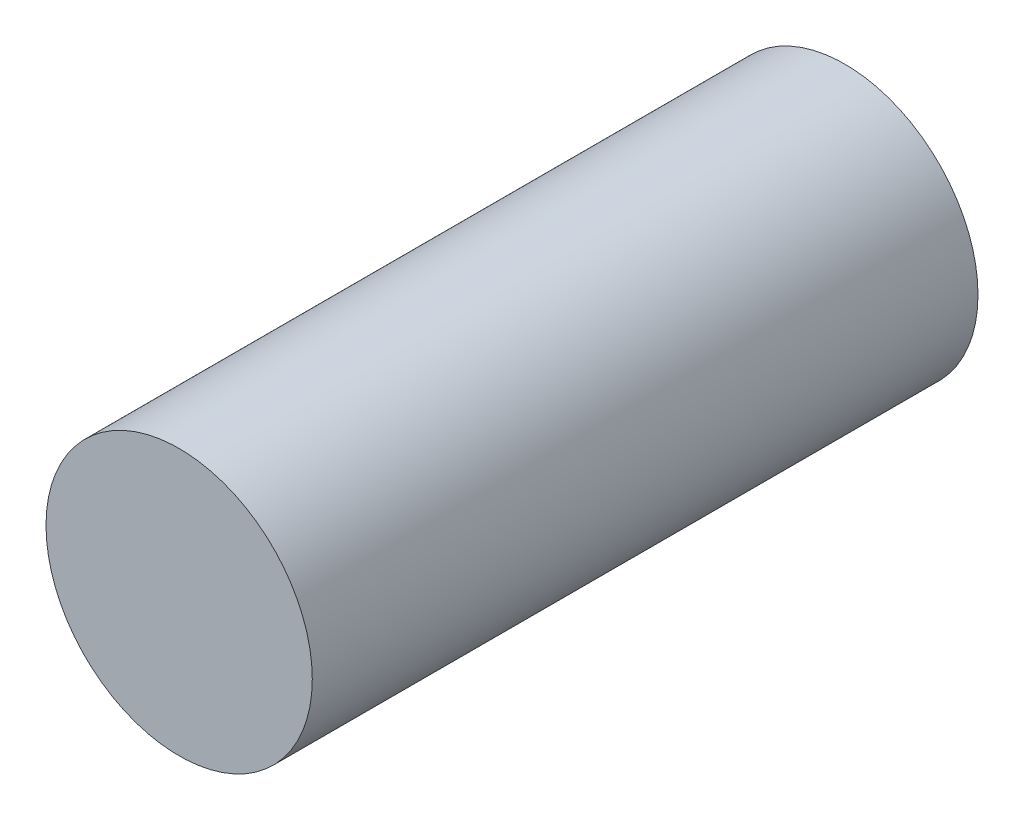
ISO-10303-21;
HEADER;
FILE_DESCRIPTION(('STEP AP214'),'2;1');
FILE_NAME('part.step','',(''),(''),'','','');
FILE_SCHEMA(('AUTOMOTIVE_DESIGN { 1 0 10303 214 1 1 1 1 }'));
ENDSEC;
DATA;
#1=APPLICATION_CONTEXT('core data for automotive mechanical design processes');
#2=APPLICATION_PROTOCOL_DEFINITION('international standard','automotive_design',2000,#1);
#3=PRODUCT_CONTEXT('',#1,'mechanical');
#4=PRODUCT('Part','Part','',(#3));
#5=PRODUCT_RELATED_PRODUCT_CATEGORY('part','',(#4));
#6=PRODUCT_DEFINITION_FORMATION('','',#4);
#7=PRODUCT_DEFINITION_CONTEXT('part definition',#1,'design');
#8=PRODUCT_DEFINITION('design','',#6,#7);
#9=PRODUCT_DEFINITION_SHAPE('','',#8);
#10=(LENGTH_UNIT() NAMED_UNIT(*) SI_UNIT(.MILLI.,.METRE.));
#11=(NAMED_UNIT(*) PLANE_ANGLE_UNIT() SI_UNIT($,.RADIAN.));
#12=(NAMED_UNIT(*) SI_UNIT($,.STERADIAN.) SOLID_ANGLE_UNIT());
#13=UNCERTAINTY_MEASURE_WITH_UNIT(LENGTH_MEASURE(1.E-05),#10,'distance_accuracy_value','');
#14=(GEOMETRIC_REPRESENTATION_CONTEXT(3) GLOBAL_UNCERTAINTY_ASSIGNED_CONTEXT((#13)) GLOBAL_UNIT_ASSIGNED_CONTEXT((#10,
#11,#12)) REPRESENTATION_CONTEXT('',''));
#15=CARTESIAN_POINT('',(0.,0.,0.));
#16=DIRECTION('',(0.,0.,1.));
#17=DIRECTION('',(1.,0.,0.));
#18=AXIS2_PLACEMENT_3D('',#15,#16,#17);
#19=CARTESIAN_POINT('',(0.,0.,-30.));
#20=DIRECTION('',(0.,0.,1.));
#21=DIRECTION('',(1.,0.,0.));
#22=AXIS2_PLACEMENT_3D('',#19,#20,#21);
#23=CYLINDRICAL_SURFACE('',#22,6.);
#24=CARTESIAN_POINT('',(0.,0.,-30.));
#25=DIRECTION('',(0.,0.,1.));
#26=DIRECTION('',(1.,0.,0.));
#27=AXIS2_PLACEMENT_3D('',#24,#25,#26);
#28=CIRCLE('',#27,6.);
#29=CARTESIAN_POINT('',(6.,0.,-30.));
#30=VERTEX_POINT('',#29);
#31=EDGE_CURVE('E10',#30,#30,#28,.T.);
#32=ORIENTED_EDGE('',*,*,#31,.T.);
#33=EDGE_LOOP('',(#32));
#34=FACE_BOUND('',#33,.T.);
#35=CARTESIAN_POINT('',(0.,0.,0.));
#36=DIRECTION('',(0.,0.,1.));
#37=DIRECTION('',(1.,0.,0.));
#38=AXIS2_PLACEMENT_3D('',#35,#36,#37);
#39=CIRCLE('',#38,6.);
#40=CARTESIAN_POINT('',(6.,0.,0.));
#41=VERTEX_POINT('',#40);
#42=EDGE_CURVE('E40',#41,#41,#39,.T.);
#43=ORIENTED_EDGE('',*,*,#42,.F.);
#44=EDGE_LOOP('',(#43));
#45=FACE_BOUND('',#44,.T.);
#46=ADVANCED_FACE('F37',(#34,#45),#23,.T.);
#47=CARTESIAN_POINT('',(0.,0.,-30.));
#48=DIRECTION('',(0.,0.,1.));
#49=DIRECTION('',(1.,0.,0.));
#50=AXIS2_PLACEMENT_3D('',#47,#48,#49);
#51=PLANE('',#50);
#52=ORIENTED_EDGE('',*,*,#31,.F.);
#53=EDGE_LOOP('',(#52));
#54=FACE_BOUND('',#53,.T.);
#55=ADVANCED_FACE('F52',(#54),#51,.F.);
#56=CARTESIAN_POINT('',(0.,0.,0.));
#57=DIRECTION('',(0.,0.,1.));
#58=DIRECTION('',(1.,0.,0.));
#59=AXIS2_PLACEMENT_3D('',#56,#57,#58);
#60=PLANE('',#59);
#61=ORIENTED_EDGE('',*,*,#42,.T.);
#62=EDGE_LOOP('',(#61));
#63=FACE_BOUND('',#62,.T.);
#64=ADVANCED_FACE('F49',(#63),#60,.T.);
#65=CLOSED_SHELL('',(#46,#55,#64));
#66=MANIFOLD_SOLID_BREP('B2',#65);
#67=ADVANCED_BREP_SHAPE_REPRESENTATION('',(#18,#66),#14);
#68=SHAPE_DEFINITION_REPRESENTATION(#9,#67);
ENDSEC;
END-ISO-10303-21;
